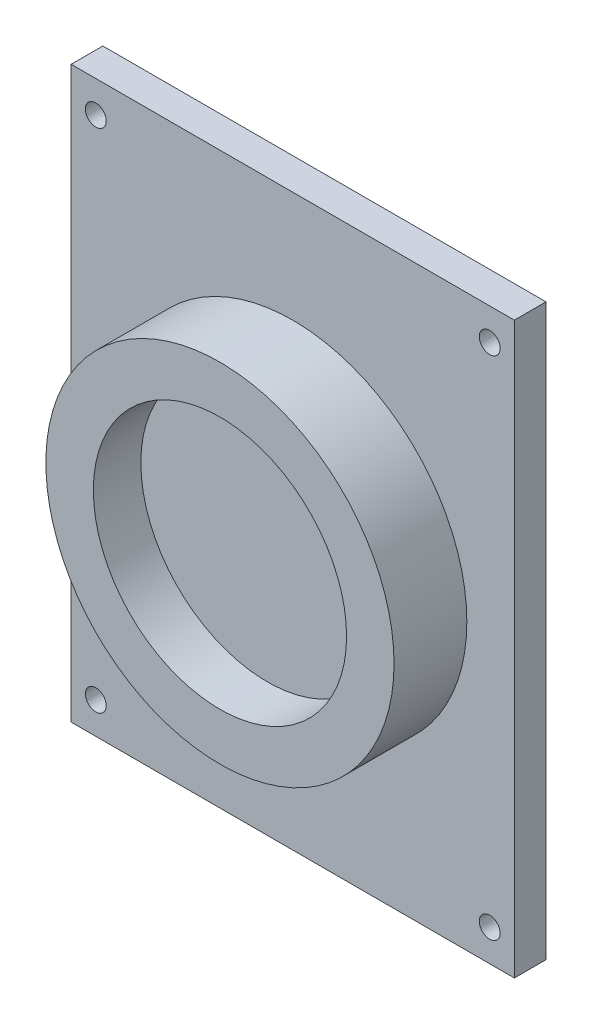
ISO-10303-21;
HEADER;
FILE_DESCRIPTION(('STEP AP214'),'2;1');
FILE_NAME('part.step','',(''),(''),'','','');
FILE_SCHEMA(('AUTOMOTIVE_DESIGN { 1 0 10303 214 1 1 1 1 }'));
ENDSEC;
DATA;
#1=APPLICATION_CONTEXT('core data for automotive mechanical design processes');
#2=APPLICATION_PROTOCOL_DEFINITION('international standard','automotive_design',2000,#1);
#3=PRODUCT_CONTEXT('',#1,'mechanical');
#4=PRODUCT('Part','Part','',(#3));
#5=PRODUCT_RELATED_PRODUCT_CATEGORY('part','',(#4));
#6=PRODUCT_DEFINITION_FORMATION('','',#4);
#7=PRODUCT_DEFINITION_CONTEXT('part definition',#1,'design');
#8=PRODUCT_DEFINITION('design','',#6,#7);
#9=PRODUCT_DEFINITION_SHAPE('','',#8);
#10=(LENGTH_UNIT() NAMED_UNIT(*) SI_UNIT(.MILLI.,.METRE.));
#11=(NAMED_UNIT(*) PLANE_ANGLE_UNIT() SI_UNIT($,.RADIAN.));
#12=(NAMED_UNIT(*) SI_UNIT($,.STERADIAN.) SOLID_ANGLE_UNIT());
#13=UNCERTAINTY_MEASURE_WITH_UNIT(LENGTH_MEASURE(1.E-05),#10,'distance_accuracy_value','');
#14=(GEOMETRIC_REPRESENTATION_CONTEXT(3) GLOBAL_UNCERTAINTY_ASSIGNED_CONTEXT((#13)) GLOBAL_UNIT_ASSIGNED_CONTEXT((#10,
#11,#12)) REPRESENTATION_CONTEXT('',''));
#15=CARTESIAN_POINT('',(0.,0.,0.));
#16=DIRECTION('',(0.,0.,1.));
#17=DIRECTION('',(1.,0.,0.));
#18=AXIS2_PLACEMENT_3D('',#15,#16,#17);
#19=CARTESIAN_POINT('',(0.,180.,10.));
#20=DIRECTION('',(1.,0.,0.));
#21=DIRECTION('',(0.,0.,-1.));
#22=AXIS2_PLACEMENT_3D('',#19,#20,#21);
#23=PLANE('',#22);
#24=DIRECTION('',(0.,-1.,0.));
#25=VECTOR('',#24,1.);
#26=CARTESIAN_POINT('',(0.,180.,0.));
#27=LINE('',#26,#25);
#28=CARTESIAN_POINT('',(0.,180.,0.));
#29=VERTEX_POINT('',#28);
#30=CARTESIAN_POINT('',(0.,0.,0.));
#31=VERTEX_POINT('',#30);
#32=EDGE_CURVE('E105',#29,#31,#27,.T.);
#33=ORIENTED_EDGE('',*,*,#32,.T.);
#34=DIRECTION('',(0.,0.,-1.));
#35=VECTOR('',#34,1.);
#36=CARTESIAN_POINT('',(0.,0.,10.));
#37=LINE('',#36,#35);
#38=CARTESIAN_POINT('',(0.,0.,10.));
#39=VERTEX_POINT('',#38);
#40=EDGE_CURVE('E96',#39,#31,#37,.T.);
#41=ORIENTED_EDGE('',*,*,#40,.F.);
#42=DIRECTION('',(0.,-1.,0.));
#43=VECTOR('',#42,1.);
#44=CARTESIAN_POINT('',(0.,180.,10.));
#45=LINE('',#44,#43);
#46=CARTESIAN_POINT('',(0.,180.,10.));
#47=VERTEX_POINT('',#46);
#48=EDGE_CURVE('E90',#47,#39,#45,.T.);
#49=ORIENTED_EDGE('',*,*,#48,.F.);
#50=DIRECTION('',(0.,0.,-1.));
#51=VECTOR('',#50,1.);
#52=CARTESIAN_POINT('',(0.,180.,10.));
#53=LINE('',#52,#51);
#54=EDGE_CURVE('E101',#47,#29,#53,.T.);
#55=ORIENTED_EDGE('',*,*,#54,.T.);
#56=EDGE_LOOP('',(#33,#41,#49,#55));
#57=FACE_BOUND('',#56,.T.);
#58=ADVANCED_FACE('F36',(#57),#23,.F.);
#59=CARTESIAN_POINT('',(0.,0.,10.));
#60=DIRECTION('',(0.,1.,0.));
#61=DIRECTION('',(0.,0.,1.));
#62=AXIS2_PLACEMENT_3D('',#59,#60,#61);
#63=PLANE('',#62);
#64=DIRECTION('',(1.,0.,0.));
#65=VECTOR('',#64,1.);
#66=CARTESIAN_POINT('',(0.,0.,0.));
#67=LINE('',#66,#65);
#68=CARTESIAN_POINT('',(140.,0.,0.));
#69=VERTEX_POINT('',#68);
#70=EDGE_CURVE('E95',#31,#69,#67,.T.);
#71=ORIENTED_EDGE('',*,*,#70,.T.);
#72=DIRECTION('',(0.,0.,-1.));
#73=VECTOR('',#72,1.);
#74=CARTESIAN_POINT('',(140.,0.,10.));
#75=LINE('',#74,#73);
#76=CARTESIAN_POINT('',(140.,0.,10.));
#77=VERTEX_POINT('',#76);
#78=EDGE_CURVE('E93',#77,#69,#75,.T.);
#79=ORIENTED_EDGE('',*,*,#78,.F.);
#80=DIRECTION('',(1.,0.,0.));
#81=VECTOR('',#80,1.);
#82=CARTESIAN_POINT('',(0.,0.,10.));
#83=LINE('',#82,#81);
#84=EDGE_CURVE('E85',#39,#77,#83,.T.);
#85=ORIENTED_EDGE('',*,*,#84,.F.);
#86=ORIENTED_EDGE('',*,*,#40,.T.);
#87=EDGE_LOOP('',(#71,#79,#85,#86));
#88=FACE_BOUND('',#87,.T.);
#89=ADVANCED_FACE('F94',(#88),#63,.F.);
#90=CARTESIAN_POINT('',(140.,0.,10.));
#91=DIRECTION('',(-1.,0.,0.));
#92=DIRECTION('',(0.,0.,1.));
#93=AXIS2_PLACEMENT_3D('',#90,#91,#92);
#94=PLANE('',#93);
#95=DIRECTION('',(0.,1.,0.));
#96=VECTOR('',#95,1.);
#97=CARTESIAN_POINT('',(140.,0.,0.));
#98=LINE('',#97,#96);
#99=CARTESIAN_POINT('',(140.,180.,0.));
#100=VERTEX_POINT('',#99);
#101=EDGE_CURVE('E71',#69,#100,#98,.T.);
#102=ORIENTED_EDGE('',*,*,#101,.T.);
#103=DIRECTION('',(0.,0.,-1.));
#104=VECTOR('',#103,1.);
#105=CARTESIAN_POINT('',(140.,180.,10.));
#106=LINE('',#105,#104);
#107=CARTESIAN_POINT('',(140.,180.,10.));
#108=VERTEX_POINT('',#107);
#109=EDGE_CURVE('E97',#108,#100,#106,.T.);
#110=ORIENTED_EDGE('',*,*,#109,.F.);
#111=DIRECTION('',(0.,1.,0.));
#112=VECTOR('',#111,1.);
#113=CARTESIAN_POINT('',(140.,0.,10.));
#114=LINE('',#113,#112);
#115=EDGE_CURVE('E88',#77,#108,#114,.T.);
#116=ORIENTED_EDGE('',*,*,#115,.F.);
#117=ORIENTED_EDGE('',*,*,#78,.T.);
#118=EDGE_LOOP('',(#102,#110,#116,#117));
#119=FACE_BOUND('',#118,.T.);
#120=ADVANCED_FACE('F99',(#119),#94,.F.);
#121=CARTESIAN_POINT('',(140.,180.,10.));
#122=DIRECTION('',(0.,-1.,0.));
#123=DIRECTION('',(1.,0.,0.));
#124=AXIS2_PLACEMENT_3D('',#121,#122,#123);
#125=PLANE('',#124);
#126=DIRECTION('',(-1.,0.,0.));
#127=VECTOR('',#126,1.);
#128=CARTESIAN_POINT('',(140.,180.,0.));
#129=LINE('',#128,#127);
#130=EDGE_CURVE('E77',#100,#29,#129,.T.);
#131=ORIENTED_EDGE('',*,*,#130,.T.);
#132=ORIENTED_EDGE('',*,*,#54,.F.);
#133=DIRECTION('',(-1.,0.,0.));
#134=VECTOR('',#133,1.);
#135=CARTESIAN_POINT('',(140.,180.,10.));
#136=LINE('',#135,#134);
#137=EDGE_CURVE('E54',#108,#47,#136,.T.);
#138=ORIENTED_EDGE('',*,*,#137,.F.);
#139=ORIENTED_EDGE('',*,*,#109,.T.);
#140=EDGE_LOOP('',(#131,#132,#138,#139));
#141=FACE_BOUND('',#140,.T.);
#142=ADVANCED_FACE('F166',(#141),#125,.F.);
#143=CARTESIAN_POINT('',(0.,0.,10.));
#144=DIRECTION('',(0.,0.,1.));
#145=DIRECTION('',(1.,0.,0.));
#146=AXIS2_PLACEMENT_3D('',#143,#144,#145);
#147=PLANE('',#146);
#148=CARTESIAN_POINT('',(132.222222222222,170.,10.));
#149=DIRECTION('',(0.,0.,1.));
#150=DIRECTION('',(1.,0.,0.));
#151=AXIS2_PLACEMENT_3D('',#148,#149,#150);
#152=CIRCLE('',#151,3.3);
#153=CARTESIAN_POINT('',(135.522222222222,170.,10.));
#154=VERTEX_POINT('',#153);
#155=EDGE_CURVE('E39',#154,#154,#152,.T.);
#156=ORIENTED_EDGE('',*,*,#155,.F.);
#157=EDGE_LOOP('',(#156));
#158=FACE_BOUND('',#157,.T.);
#159=CARTESIAN_POINT('',(7.77777777777776,170.,10.));
#160=DIRECTION('',(0.,0.,1.));
#161=DIRECTION('',(1.,0.,0.));
#162=AXIS2_PLACEMENT_3D('',#159,#160,#161);
#163=CIRCLE('',#162,3.3);
#164=CARTESIAN_POINT('',(11.0777777777778,170.,10.));
#165=VERTEX_POINT('',#164);
#166=EDGE_CURVE('E124',#165,#165,#163,.T.);
#167=ORIENTED_EDGE('',*,*,#166,.F.);
#168=EDGE_LOOP('',(#167));
#169=FACE_BOUND('',#168,.T.);
#170=CARTESIAN_POINT('',(7.77777777777776,9.99999999999999,10.));
#171=DIRECTION('',(0.,0.,1.));
#172=DIRECTION('',(1.,0.,0.));
#173=AXIS2_PLACEMENT_3D('',#170,#171,#172);
#174=CIRCLE('',#173,3.3);
#175=CARTESIAN_POINT('',(11.0777777777778,9.99999999999999,10.));
#176=VERTEX_POINT('',#175);
#177=EDGE_CURVE('E120',#176,#176,#174,.T.);
#178=ORIENTED_EDGE('',*,*,#177,.F.);
#179=EDGE_LOOP('',(#178));
#180=FACE_BOUND('',#179,.T.);
#181=CARTESIAN_POINT('',(132.222222222222,9.99999999999999,10.));
#182=DIRECTION('',(0.,0.,1.));
#183=DIRECTION('',(1.,0.,0.));
#184=AXIS2_PLACEMENT_3D('',#181,#182,#183);
#185=CIRCLE('',#184,3.3);
#186=CARTESIAN_POINT('',(135.522222222222,9.99999999999999,10.));
#187=VERTEX_POINT('',#186);
#188=EDGE_CURVE('E115',#187,#187,#185,.T.);
#189=ORIENTED_EDGE('',*,*,#188,.F.);
#190=EDGE_LOOP('',(#189));
#191=FACE_BOUND('',#190,.T.);
#192=CARTESIAN_POINT('',(70.,90.,10.));
#193=DIRECTION('',(0.,0.,1.));
#194=DIRECTION('',(1.,0.,0.));
#195=AXIS2_PLACEMENT_3D('',#192,#193,#194);
#196=CIRCLE('',#195,55.);
#197=CARTESIAN_POINT('',(125.,90.,10.));
#198=VERTEX_POINT('',#197);
#199=EDGE_CURVE('E45',#198,#198,#196,.T.);
#200=ORIENTED_EDGE('',*,*,#199,.F.);
#201=EDGE_LOOP('',(#200));
#202=FACE_BOUND('',#201,.T.);
#203=ORIENTED_EDGE('',*,*,#48,.T.);
#204=ORIENTED_EDGE('',*,*,#84,.T.);
#205=ORIENTED_EDGE('',*,*,#115,.T.);
#206=ORIENTED_EDGE('',*,*,#137,.T.);
#207=EDGE_LOOP('',(#203,#204,#205,#206));
#208=FACE_BOUND('',#207,.T.);
#209=ADVANCED_FACE('F86',(#158,#169,#180,#191,#202,#208),#147,.T.);
#210=CARTESIAN_POINT('',(0.,0.,0.));
#211=DIRECTION('',(0.,0.,1.));
#212=DIRECTION('',(1.,0.,0.));
#213=AXIS2_PLACEMENT_3D('',#210,#211,#212);
#214=PLANE('',#213);
#215=CARTESIAN_POINT('',(132.222222222222,170.,0.));
#216=DIRECTION('',(0.,0.,-1.));
#217=DIRECTION('',(-1.,0.,0.));
#218=AXIS2_PLACEMENT_3D('',#215,#216,#217);
#219=CIRCLE('',#218,5.50000000000001);
#220=CARTESIAN_POINT('',(126.722222222222,170.,0.));
#221=VERTEX_POINT('',#220);
#222=EDGE_CURVE('E373',#221,#221,#219,.T.);
#223=ORIENTED_EDGE('',*,*,#222,.F.);
#224=EDGE_LOOP('',(#223));
#225=FACE_BOUND('',#224,.T.);
#226=CARTESIAN_POINT('',(7.77777777777776,170.,0.));
#227=DIRECTION('',(0.,0.,-1.));
#228=DIRECTION('',(-1.,0.,0.));
#229=AXIS2_PLACEMENT_3D('',#226,#227,#228);
#230=CIRCLE('',#229,5.49999999999999);
#231=CARTESIAN_POINT('',(2.27777777777776,170.,0.));
#232=VERTEX_POINT('',#231);
#233=EDGE_CURVE('E139',#232,#232,#230,.T.);
#234=ORIENTED_EDGE('',*,*,#233,.F.);
#235=EDGE_LOOP('',(#234));
#236=FACE_BOUND('',#235,.T.);
#237=CARTESIAN_POINT('',(7.77777777777776,9.99999999999999,0.));
#238=DIRECTION('',(0.,0.,-1.));
#239=DIRECTION('',(-1.,0.,0.));
#240=AXIS2_PLACEMENT_3D('',#237,#238,#239);
#241=CIRCLE('',#240,5.49999999999999);
#242=CARTESIAN_POINT('',(2.27777777777776,9.99999999999999,0.));
#243=VERTEX_POINT('',#242);
#244=EDGE_CURVE('E126',#243,#243,#241,.T.);
#245=ORIENTED_EDGE('',*,*,#244,.F.);
#246=EDGE_LOOP('',(#245));
#247=FACE_BOUND('',#246,.T.);
#248=CARTESIAN_POINT('',(132.222222222222,9.99999999999999,0.));
#249=DIRECTION('',(0.,0.,-1.));
#250=DIRECTION('',(-1.,0.,0.));
#251=AXIS2_PLACEMENT_3D('',#248,#249,#250);
#252=CIRCLE('',#251,5.50000000000001);
#253=CARTESIAN_POINT('',(126.722222222222,9.99999999999999,0.));
#254=VERTEX_POINT('',#253);
#255=EDGE_CURVE('E122',#254,#254,#252,.T.);
#256=ORIENTED_EDGE('',*,*,#255,.F.);
#257=EDGE_LOOP('',(#256));
#258=FACE_BOUND('',#257,.T.);
#259=ORIENTED_EDGE('',*,*,#32,.F.);
#260=ORIENTED_EDGE('',*,*,#130,.F.);
#261=ORIENTED_EDGE('',*,*,#101,.F.);
#262=ORIENTED_EDGE('',*,*,#70,.F.);
#263=EDGE_LOOP('',(#259,#260,#261,#262));
#264=FACE_BOUND('',#263,.T.);
#265=ADVANCED_FACE('F165',(#225,#236,#247,#258,#264),#214,.F.);
#266=CARTESIAN_POINT('',(70.,90.,18.));
#267=DIRECTION('',(0.,0.,-1.));
#268=DIRECTION('',(-1.,0.,0.));
#269=AXIS2_PLACEMENT_3D('',#266,#267,#268);
#270=CYLINDRICAL_SURFACE('',#269,55.);
#271=ORIENTED_EDGE('',*,*,#199,.T.);
#272=EDGE_LOOP('',(#271));
#273=FACE_BOUND('',#272,.T.);
#274=CARTESIAN_POINT('',(70.,90.,33.));
#275=DIRECTION('',(0.,0.,1.));
#276=DIRECTION('',(1.,0.,0.));
#277=AXIS2_PLACEMENT_3D('',#274,#275,#276);
#278=CIRCLE('',#277,55.);
#279=CARTESIAN_POINT('',(125.,90.,33.));
#280=VERTEX_POINT('',#279);
#281=EDGE_CURVE('E108',#280,#280,#278,.T.);
#282=ORIENTED_EDGE('',*,*,#281,.F.);
#283=EDGE_LOOP('',(#282));
#284=FACE_BOUND('',#283,.T.);
#285=ADVANCED_FACE('F161',(#273,#284),#270,.T.);
#286=CARTESIAN_POINT('',(70.,90.,33.));
#287=DIRECTION('',(0.,0.,1.));
#288=DIRECTION('',(1.,0.,0.));
#289=AXIS2_PLACEMENT_3D('',#286,#287,#288);
#290=PLANE('',#289);
#291=ORIENTED_EDGE('',*,*,#281,.T.);
#292=EDGE_LOOP('',(#291));
#293=FACE_BOUND('',#292,.T.);
#294=CARTESIAN_POINT('',(70.,90.,33.));
#295=DIRECTION('',(0.,0.,1.));
#296=DIRECTION('',(1.,0.,0.));
#297=AXIS2_PLACEMENT_3D('',#294,#295,#296);
#298=CIRCLE('',#297,40.);
#299=CARTESIAN_POINT('',(110.,90.,33.));
#300=VERTEX_POINT('',#299);
#301=EDGE_CURVE('E118',#300,#300,#298,.T.);
#302=ORIENTED_EDGE('',*,*,#301,.F.);
#303=EDGE_LOOP('',(#302));
#304=FACE_BOUND('',#303,.T.);
#305=ADVANCED_FACE('F206',(#293,#304),#290,.T.);
#306=CARTESIAN_POINT('',(70.,90.,33.));
#307=DIRECTION('',(0.,0.,-1.));
#308=DIRECTION('',(-1.,0.,0.));
#309=AXIS2_PLACEMENT_3D('',#306,#307,#308);
#310=CYLINDRICAL_SURFACE('',#309,40.);
#311=ORIENTED_EDGE('',*,*,#301,.T.);
#312=EDGE_LOOP('',(#311));
#313=FACE_BOUND('',#312,.T.);
#314=CARTESIAN_POINT('',(70.,90.,18.));
#315=DIRECTION('',(0.,0.,1.));
#316=DIRECTION('',(1.,0.,0.));
#317=AXIS2_PLACEMENT_3D('',#314,#315,#316);
#318=CIRCLE('',#317,40.);
#319=CARTESIAN_POINT('',(110.,90.,18.));
#320=VERTEX_POINT('',#319);
#321=EDGE_CURVE('E11',#320,#320,#318,.F.);
#322=ORIENTED_EDGE('',*,*,#321,.T.);
#323=EDGE_LOOP('',(#322));
#324=FACE_BOUND('',#323,.T.);
#325=ADVANCED_FACE('F216',(#313,#324),#310,.F.);
#326=CARTESIAN_POINT('',(70.,90.,18.));
#327=DIRECTION('',(0.,0.,1.));
#328=DIRECTION('',(1.,0.,0.));
#329=AXIS2_PLACEMENT_3D('',#326,#327,#328);
#330=PLANE('',#329);
#331=ORIENTED_EDGE('',*,*,#321,.F.);
#332=EDGE_LOOP('',(#331));
#333=FACE_BOUND('',#332,.T.);
#334=ADVANCED_FACE('F226',(#333),#330,.T.);
#335=CARTESIAN_POINT('',(132.222222222222,9.99999999999999,0.));
#336=DIRECTION('',(0.,0.,-1.));
#337=DIRECTION('',(-1.,0.,0.));
#338=AXIS2_PLACEMENT_3D('',#335,#336,#337);
#339=CYLINDRICAL_SURFACE('',#338,3.3);
#340=ORIENTED_EDGE('',*,*,#188,.T.);
#341=EDGE_LOOP('',(#340));
#342=FACE_BOUND('',#341,.T.);
#343=CARTESIAN_POINT('',(132.222222222222,9.99999999999999,3.9));
#344=DIRECTION('',(0.,0.,-1.));
#345=DIRECTION('',(-1.,0.,0.));
#346=AXIS2_PLACEMENT_3D('',#343,#344,#345);
#347=CIRCLE('',#346,3.3);
#348=CARTESIAN_POINT('',(128.922222222222,9.99999999999999,3.9));
#349=VERTEX_POINT('',#348);
#350=EDGE_CURVE('E119',#349,#349,#347,.T.);
#351=ORIENTED_EDGE('',*,*,#350,.T.);
#352=EDGE_LOOP('',(#351));
#353=FACE_BOUND('',#352,.T.);
#354=ADVANCED_FACE('F235',(#342,#353),#339,.F.);
#355=CARTESIAN_POINT('',(135.522222222222,9.99999999999999,3.9));
#356=DIRECTION('',(0.,0.,1.));
#357=DIRECTION('',(1.,0.,0.));
#358=AXIS2_PLACEMENT_3D('',#355,#356,#357);
#359=PLANE('',#358);
#360=ORIENTED_EDGE('',*,*,#350,.F.);
#361=EDGE_LOOP('',(#360));
#362=FACE_BOUND('',#361,.T.);
#363=CARTESIAN_POINT('',(132.222222222222,9.99999999999999,3.9));
#364=DIRECTION('',(0.,0.,-1.));
#365=DIRECTION('',(-1.,0.,0.));
#366=AXIS2_PLACEMENT_3D('',#363,#364,#365);
#367=CIRCLE('',#366,5.50000000000001);
#368=CARTESIAN_POINT('',(126.722222222222,9.99999999999999,3.9));
#369=VERTEX_POINT('',#368);
#370=EDGE_CURVE('E149',#369,#369,#367,.T.);
#371=ORIENTED_EDGE('',*,*,#370,.T.);
#372=EDGE_LOOP('',(#371));
#373=FACE_BOUND('',#372,.T.);
#374=ADVANCED_FACE('F254',(#362,#373),#359,.F.);
#375=CARTESIAN_POINT('',(132.222222222222,9.99999999999999,0.));
#376=DIRECTION('',(0.,0.,-1.));
#377=DIRECTION('',(-1.,0.,0.));
#378=AXIS2_PLACEMENT_3D('',#375,#376,#377);
#379=CYLINDRICAL_SURFACE('',#378,5.50000000000001);
#380=ORIENTED_EDGE('',*,*,#370,.F.);
#381=EDGE_LOOP('',(#380));
#382=FACE_BOUND('',#381,.T.);
#383=ORIENTED_EDGE('',*,*,#255,.T.);
#384=EDGE_LOOP('',(#383));
#385=FACE_BOUND('',#384,.T.);
#386=ADVANCED_FACE('F264',(#382,#385),#379,.F.);
#387=CARTESIAN_POINT('',(7.77777777777776,9.99999999999999,0.));
#388=DIRECTION('',(0.,0.,-1.));
#389=DIRECTION('',(-1.,0.,0.));
#390=AXIS2_PLACEMENT_3D('',#387,#388,#389);
#391=CYLINDRICAL_SURFACE('',#390,3.3);
#392=ORIENTED_EDGE('',*,*,#177,.T.);
#393=EDGE_LOOP('',(#392));
#394=FACE_BOUND('',#393,.T.);
#395=CARTESIAN_POINT('',(7.77777777777776,9.99999999999999,3.9));
#396=DIRECTION('',(0.,0.,-1.));
#397=DIRECTION('',(-1.,0.,0.));
#398=AXIS2_PLACEMENT_3D('',#395,#396,#397);
#399=CIRCLE('',#398,3.3);
#400=CARTESIAN_POINT('',(4.47777777777776,9.99999999999999,3.9));
#401=VERTEX_POINT('',#400);
#402=EDGE_CURVE('E123',#401,#401,#399,.T.);
#403=ORIENTED_EDGE('',*,*,#402,.T.);
#404=EDGE_LOOP('',(#403));
#405=FACE_BOUND('',#404,.T.);
#406=ADVANCED_FACE('F274',(#394,#405),#391,.F.);
#407=CARTESIAN_POINT('',(11.0777777777778,9.99999999999999,3.9));
#408=DIRECTION('',(0.,0.,1.));
#409=DIRECTION('',(1.,0.,0.));
#410=AXIS2_PLACEMENT_3D('',#407,#408,#409);
#411=PLANE('',#410);
#412=ORIENTED_EDGE('',*,*,#402,.F.);
#413=EDGE_LOOP('',(#412));
#414=FACE_BOUND('',#413,.T.);
#415=CARTESIAN_POINT('',(7.77777777777776,9.99999999999999,3.9));
#416=DIRECTION('',(0.,0.,-1.));
#417=DIRECTION('',(-1.,0.,0.));
#418=AXIS2_PLACEMENT_3D('',#415,#416,#417);
#419=CIRCLE('',#418,5.5);
#420=CARTESIAN_POINT('',(2.27777777777776,9.99999999999999,3.9));
#421=VERTEX_POINT('',#420);
#422=EDGE_CURVE('E131',#421,#421,#419,.T.);
#423=ORIENTED_EDGE('',*,*,#422,.T.);
#424=EDGE_LOOP('',(#423));
#425=FACE_BOUND('',#424,.T.);
#426=ADVANCED_FACE('F284',(#414,#425),#411,.F.);
#427=CARTESIAN_POINT('',(7.77777777777776,9.99999999999999,0.));
#428=DIRECTION('',(0.,0.,-1.));
#429=DIRECTION('',(-1.,0.,0.));
#430=AXIS2_PLACEMENT_3D('',#427,#428,#429);
#431=CYLINDRICAL_SURFACE('',#430,5.5);
#432=ORIENTED_EDGE('',*,*,#422,.F.);
#433=EDGE_LOOP('',(#432));
#434=FACE_BOUND('',#433,.T.);
#435=ORIENTED_EDGE('',*,*,#244,.T.);
#436=EDGE_LOOP('',(#435));
#437=FACE_BOUND('',#436,.T.);
#438=ADVANCED_FACE('F294',(#434,#437),#431,.F.);
#439=CARTESIAN_POINT('',(7.77777777777776,170.,0.));
#440=DIRECTION('',(0.,0.,-1.));
#441=DIRECTION('',(-1.,0.,0.));
#442=AXIS2_PLACEMENT_3D('',#439,#440,#441);
#443=CYLINDRICAL_SURFACE('',#442,3.3);
#444=ORIENTED_EDGE('',*,*,#166,.T.);
#445=EDGE_LOOP('',(#444));
#446=FACE_BOUND('',#445,.T.);
#447=CARTESIAN_POINT('',(7.77777777777776,170.,3.9));
#448=DIRECTION('',(0.,0.,-1.));
#449=DIRECTION('',(-1.,0.,0.));
#450=AXIS2_PLACEMENT_3D('',#447,#448,#449);
#451=CIRCLE('',#450,3.3);
#452=CARTESIAN_POINT('',(4.47777777777776,170.,3.9));
#453=VERTEX_POINT('',#452);
#454=EDGE_CURVE('E127',#453,#453,#451,.T.);
#455=ORIENTED_EDGE('',*,*,#454,.T.);
#456=EDGE_LOOP('',(#455));
#457=FACE_BOUND('',#456,.T.);
#458=ADVANCED_FACE('F304',(#446,#457),#443,.F.);
#459=CARTESIAN_POINT('',(11.0777777777778,170.,3.9));
#460=DIRECTION('',(0.,0.,1.));
#461=DIRECTION('',(1.,0.,0.));
#462=AXIS2_PLACEMENT_3D('',#459,#460,#461);
#463=PLANE('',#462);
#464=ORIENTED_EDGE('',*,*,#454,.F.);
#465=EDGE_LOOP('',(#464));
#466=FACE_BOUND('',#465,.T.);
#467=CARTESIAN_POINT('',(7.77777777777776,170.,3.9));
#468=DIRECTION('',(0.,0.,-1.));
#469=DIRECTION('',(-1.,0.,0.));
#470=AXIS2_PLACEMENT_3D('',#467,#468,#469);
#471=CIRCLE('',#470,5.5);
#472=CARTESIAN_POINT('',(2.27777777777776,170.,3.9));
#473=VERTEX_POINT('',#472);
#474=EDGE_CURVE('E134',#473,#473,#471,.T.);
#475=ORIENTED_EDGE('',*,*,#474,.T.);
#476=EDGE_LOOP('',(#475));
#477=FACE_BOUND('',#476,.T.);
#478=ADVANCED_FACE('F314',(#466,#477),#463,.F.);
#479=CARTESIAN_POINT('',(7.77777777777776,170.,0.));
#480=DIRECTION('',(0.,0.,-1.));
#481=DIRECTION('',(-1.,0.,0.));
#482=AXIS2_PLACEMENT_3D('',#479,#480,#481);
#483=CYLINDRICAL_SURFACE('',#482,5.5);
#484=ORIENTED_EDGE('',*,*,#474,.F.);
#485=EDGE_LOOP('',(#484));
#486=FACE_BOUND('',#485,.T.);
#487=ORIENTED_EDGE('',*,*,#233,.T.);
#488=EDGE_LOOP('',(#487));
#489=FACE_BOUND('',#488,.T.);
#490=ADVANCED_FACE('F323',(#486,#489),#483,.F.);
#491=CARTESIAN_POINT('',(132.222222222222,170.,0.));
#492=DIRECTION('',(0.,0.,-1.));
#493=DIRECTION('',(-1.,0.,0.));
#494=AXIS2_PLACEMENT_3D('',#491,#492,#493);
#495=CYLINDRICAL_SURFACE('',#494,3.3);
#496=ORIENTED_EDGE('',*,*,#155,.T.);
#497=EDGE_LOOP('',(#496));
#498=FACE_BOUND('',#497,.T.);
#499=CARTESIAN_POINT('',(132.222222222222,170.,3.9));
#500=DIRECTION('',(0.,0.,-1.));
#501=DIRECTION('',(-1.,0.,0.));
#502=AXIS2_PLACEMENT_3D('',#499,#500,#501);
#503=CIRCLE('',#502,3.3);
#504=CARTESIAN_POINT('',(128.922222222222,170.,3.9));
#505=VERTEX_POINT('',#504);
#506=EDGE_CURVE('E375',#505,#505,#503,.T.);
#507=ORIENTED_EDGE('',*,*,#506,.T.);
#508=EDGE_LOOP('',(#507));
#509=FACE_BOUND('',#508,.T.);
#510=ADVANCED_FACE('F333',(#498,#509),#495,.F.);
#511=CARTESIAN_POINT('',(135.522222222222,170.,3.9));
#512=DIRECTION('',(0.,0.,1.));
#513=DIRECTION('',(1.,0.,0.));
#514=AXIS2_PLACEMENT_3D('',#511,#512,#513);
#515=PLANE('',#514);
#516=ORIENTED_EDGE('',*,*,#506,.F.);
#517=EDGE_LOOP('',(#516));
#518=FACE_BOUND('',#517,.T.);
#519=CARTESIAN_POINT('',(132.222222222222,170.,3.9));
#520=DIRECTION('',(0.,0.,-1.));
#521=DIRECTION('',(-1.,0.,0.));
#522=AXIS2_PLACEMENT_3D('',#519,#520,#521);
#523=CIRCLE('',#522,5.50000000000001);
#524=CARTESIAN_POINT('',(126.722222222222,170.,3.9));
#525=VERTEX_POINT('',#524);
#526=EDGE_CURVE('E370',#525,#525,#523,.T.);
#527=ORIENTED_EDGE('',*,*,#526,.T.);
#528=EDGE_LOOP('',(#527));
#529=FACE_BOUND('',#528,.T.);
#530=ADVANCED_FACE('F343',(#518,#529),#515,.F.);
#531=CARTESIAN_POINT('',(132.222222222222,170.,0.));
#532=DIRECTION('',(0.,0.,-1.));
#533=DIRECTION('',(-1.,0.,0.));
#534=AXIS2_PLACEMENT_3D('',#531,#532,#533);
#535=CYLINDRICAL_SURFACE('',#534,5.50000000000001);
#536=ORIENTED_EDGE('',*,*,#526,.F.);
#537=EDGE_LOOP('',(#536));
#538=FACE_BOUND('',#537,.T.);
#539=ORIENTED_EDGE('',*,*,#222,.T.);
#540=EDGE_LOOP('',(#539));
#541=FACE_BOUND('',#540,.T.);
#542=ADVANCED_FACE('F353',(#538,#541),#535,.F.);
#543=CLOSED_SHELL('',(#58,#89,#120,#142,#209,#265,#285,#305,#325,#334,#354,#374,#386,#406,#426,
#438,#458,#478,#490,#510,#530,#542));
#544=MANIFOLD_SOLID_BREP('B2',#543);
#545=ADVANCED_BREP_SHAPE_REPRESENTATION('',(#18,#544),#14);
#546=SHAPE_DEFINITION_REPRESENTATION(#9,#545);
ENDSEC;
END-ISO-10303-21;
